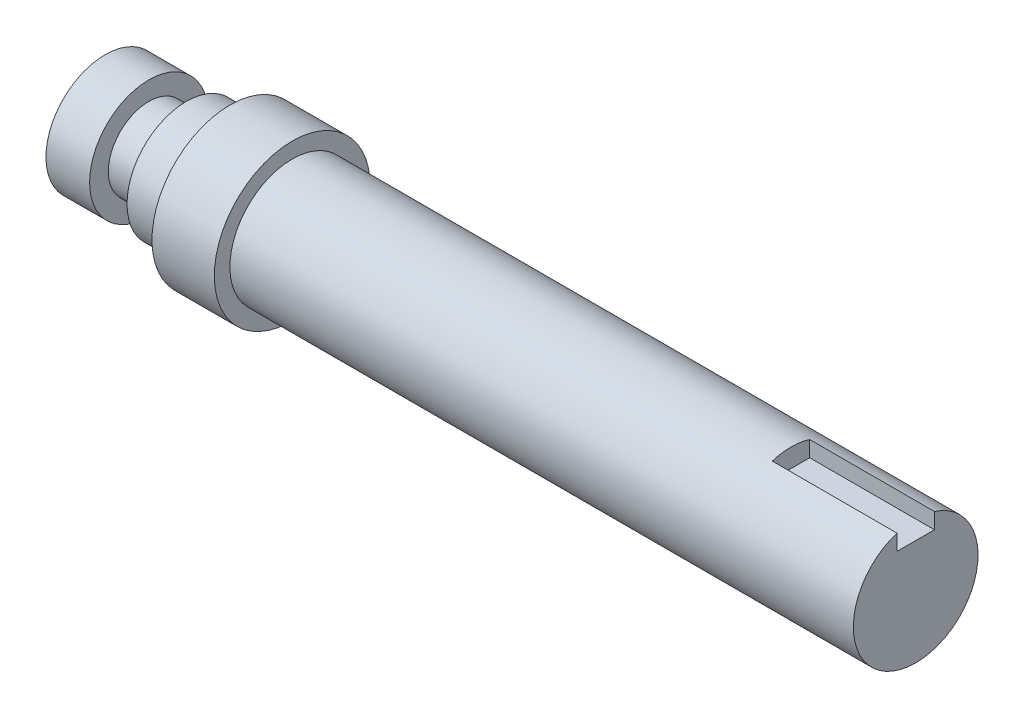
ISO-10303-21;
HEADER;
FILE_DESCRIPTION(('STEP AP214'),'2;1');
FILE_NAME('part.step','',(''),(''),'','','');
FILE_SCHEMA(('AUTOMOTIVE_DESIGN { 1 0 10303 214 1 1 1 1 }'));
ENDSEC;
DATA;
#1=APPLICATION_CONTEXT('core data for automotive mechanical design processes');
#2=APPLICATION_PROTOCOL_DEFINITION('international standard','automotive_design',2000,#1);
#3=PRODUCT_CONTEXT('',#1,'mechanical');
#4=PRODUCT('Part','Part','',(#3));
#5=PRODUCT_RELATED_PRODUCT_CATEGORY('part','',(#4));
#6=PRODUCT_DEFINITION_FORMATION('','',#4);
#7=PRODUCT_DEFINITION_CONTEXT('part definition',#1,'design');
#8=PRODUCT_DEFINITION('design','',#6,#7);
#9=PRODUCT_DEFINITION_SHAPE('','',#8);
#10=(LENGTH_UNIT() NAMED_UNIT(*) SI_UNIT(.MILLI.,.METRE.));
#11=(NAMED_UNIT(*) PLANE_ANGLE_UNIT() SI_UNIT($,.RADIAN.));
#12=(NAMED_UNIT(*) SI_UNIT($,.STERADIAN.) SOLID_ANGLE_UNIT());
#13=UNCERTAINTY_MEASURE_WITH_UNIT(LENGTH_MEASURE(1.E-05),#10,'distance_accuracy_value','');
#14=(GEOMETRIC_REPRESENTATION_CONTEXT(3) GLOBAL_UNCERTAINTY_ASSIGNED_CONTEXT((#13)) GLOBAL_UNIT_ASSIGNED_CONTEXT((#10,
#11,#12)) REPRESENTATION_CONTEXT('',''));
#15=CARTESIAN_POINT('',(0.,0.,0.));
#16=DIRECTION('',(0.,0.,1.));
#17=DIRECTION('',(1.,0.,0.));
#18=AXIS2_PLACEMENT_3D('',#15,#16,#17);
#19=CARTESIAN_POINT('',(0.,0.,0.));
#20=DIRECTION('',(1.,0.,0.));
#21=DIRECTION('',(0.,1.,0.));
#22=AXIS2_PLACEMENT_3D('',#19,#20,#21);
#23=CYLINDRICAL_SURFACE('',#22,9.5);
#24=CARTESIAN_POINT('',(-110.,0.,0.));
#25=DIRECTION('',(1.,0.,0.));
#26=DIRECTION('',(0.,1.,0.));
#27=AXIS2_PLACEMENT_3D('',#24,#25,#26);
#28=CIRCLE('',#27,9.5);
#29=CARTESIAN_POINT('',(-110.,9.49999999999998,0.));
#30=VERTEX_POINT('',#29);
#31=EDGE_CURVE('E147',#30,#30,#28,.T.);
#32=ORIENTED_EDGE('',*,*,#31,.F.);
#33=EDGE_LOOP('',(#32));
#34=FACE_BOUND('',#33,.T.);
#35=CARTESIAN_POINT('',(-117.,0.,0.));
#36=DIRECTION('',(-1.,0.,0.));
#37=DIRECTION('',(0.,-1.,0.));
#38=AXIS2_PLACEMENT_3D('',#35,#36,#37);
#39=CIRCLE('',#38,9.49999999999999);
#40=CARTESIAN_POINT('',(-117.,-9.5,0.));
#41=VERTEX_POINT('',#40);
#42=EDGE_CURVE('E114',#41,#41,#39,.T.);
#43=ORIENTED_EDGE('',*,*,#42,.F.);
#44=EDGE_LOOP('',(#43));
#45=FACE_BOUND('',#44,.T.);
#46=ADVANCED_FACE('F41',(#34,#45),#23,.T.);
#47=CARTESIAN_POINT('',(0.,10.,0.));
#48=DIRECTION('',(1.,0.,0.));
#49=DIRECTION('',(0.,1.,0.));
#50=AXIS2_PLACEMENT_3D('',#47,#48,#49);
#51=PLANE('',#50);
#52=DIRECTION('',(0.,1.,0.));
#53=VECTOR('',#52,1.);
#54=CARTESIAN_POINT('',(0.,12.,-3.));
#55=LINE('',#54,#53);
#56=CARTESIAN_POINT('',(0.,7.,-3.));
#57=VERTEX_POINT('',#56);
#58=CARTESIAN_POINT('',(0.,9.53939201416946,-3.));
#59=VERTEX_POINT('',#58);
#60=EDGE_CURVE('E88',#57,#59,#55,.T.);
#61=ORIENTED_EDGE('',*,*,#60,.F.);
#62=DIRECTION('',(0.,0.,1.));
#63=VECTOR('',#62,1.);
#64=CARTESIAN_POINT('',(0.,7.,-3.));
#65=LINE('',#64,#63);
#66=CARTESIAN_POINT('',(0.,7.,3.));
#67=VERTEX_POINT('',#66);
#68=EDGE_CURVE('E96',#57,#67,#65,.T.);
#69=ORIENTED_EDGE('',*,*,#68,.T.);
#70=DIRECTION('',(0.,1.,0.));
#71=VECTOR('',#70,1.);
#72=CARTESIAN_POINT('',(0.,12.,3.));
#73=LINE('',#72,#71);
#74=CARTESIAN_POINT('',(0.,9.53939201416946,3.));
#75=VERTEX_POINT('',#74);
#76=EDGE_CURVE('E104',#67,#75,#73,.T.);
#77=ORIENTED_EDGE('',*,*,#76,.T.);
#78=CARTESIAN_POINT('',(0.,0.,0.));
#79=DIRECTION('',(1.,0.,0.));
#80=DIRECTION('',(0.,1.,0.));
#81=AXIS2_PLACEMENT_3D('',#78,#79,#80);
#82=CIRCLE('',#81,10.);
#83=EDGE_CURVE('E131',#75,#59,#82,.T.);
#84=ORIENTED_EDGE('',*,*,#83,.T.);
#85=EDGE_LOOP('',(#61,#69,#77,#84));
#86=FACE_BOUND('',#85,.T.);
#87=ADVANCED_FACE('F43',(#86),#51,.T.);
#88=CARTESIAN_POINT('',(-110.,9.49999999999998,0.));
#89=DIRECTION('',(-1.,0.,0.));
#90=DIRECTION('',(0.,-1.,0.));
#91=AXIS2_PLACEMENT_3D('',#88,#89,#90);
#92=PLANE('',#91);
#93=ORIENTED_EDGE('',*,*,#31,.T.);
#94=EDGE_LOOP('',(#93));
#95=FACE_BOUND('',#94,.T.);
#96=CARTESIAN_POINT('',(-110.,0.,0.));
#97=DIRECTION('',(1.,0.,0.));
#98=DIRECTION('',(0.,1.,0.));
#99=AXIS2_PLACEMENT_3D('',#96,#97,#98);
#100=CIRCLE('',#99,12.5);
#101=CARTESIAN_POINT('',(-110.,12.5,0.));
#102=VERTEX_POINT('',#101);
#103=EDGE_CURVE('E143',#102,#102,#100,.T.);
#104=ORIENTED_EDGE('',*,*,#103,.F.);
#105=EDGE_LOOP('',(#104));
#106=FACE_BOUND('',#105,.T.);
#107=ADVANCED_FACE('F167',(#95,#106),#92,.T.);
#108=CARTESIAN_POINT('',(0.,0.,0.));
#109=DIRECTION('',(1.,0.,0.));
#110=DIRECTION('',(0.,1.,0.));
#111=AXIS2_PLACEMENT_3D('',#108,#109,#110);
#112=CYLINDRICAL_SURFACE('',#111,12.5);
#113=ORIENTED_EDGE('',*,*,#103,.T.);
#114=EDGE_LOOP('',(#113));
#115=FACE_BOUND('',#114,.T.);
#116=CARTESIAN_POINT('',(-100.,0.,0.));
#117=DIRECTION('',(1.,0.,0.));
#118=DIRECTION('',(0.,1.,0.));
#119=AXIS2_PLACEMENT_3D('',#116,#117,#118);
#120=CIRCLE('',#119,12.5);
#121=CARTESIAN_POINT('',(-100.,12.5,0.));
#122=VERTEX_POINT('',#121);
#123=EDGE_CURVE('E139',#122,#122,#120,.T.);
#124=ORIENTED_EDGE('',*,*,#123,.F.);
#125=EDGE_LOOP('',(#124));
#126=FACE_BOUND('',#125,.T.);
#127=ADVANCED_FACE('F172',(#115,#126),#112,.T.);
#128=CARTESIAN_POINT('',(-100.,12.5,0.));
#129=DIRECTION('',(1.,0.,0.));
#130=DIRECTION('',(0.,1.,0.));
#131=AXIS2_PLACEMENT_3D('',#128,#129,#130);
#132=PLANE('',#131);
#133=ORIENTED_EDGE('',*,*,#123,.T.);
#134=EDGE_LOOP('',(#133));
#135=FACE_BOUND('',#134,.T.);
#136=CARTESIAN_POINT('',(-100.,0.,0.));
#137=DIRECTION('',(1.,0.,0.));
#138=DIRECTION('',(0.,1.,0.));
#139=AXIS2_PLACEMENT_3D('',#136,#137,#138);
#140=CIRCLE('',#139,10.);
#141=CARTESIAN_POINT('',(-100.,10.,0.));
#142=VERTEX_POINT('',#141);
#143=EDGE_CURVE('E135',#142,#142,#140,.T.);
#144=ORIENTED_EDGE('',*,*,#143,.F.);
#145=EDGE_LOOP('',(#144));
#146=FACE_BOUND('',#145,.T.);
#147=ADVANCED_FACE('F213',(#135,#146),#132,.T.);
#148=CARTESIAN_POINT('',(0.,0.,0.));
#149=DIRECTION('',(1.,0.,0.));
#150=DIRECTION('',(0.,1.,0.));
#151=AXIS2_PLACEMENT_3D('',#148,#149,#150);
#152=CYLINDRICAL_SURFACE('',#151,10.);
#153=DIRECTION('',(1.,0.,0.));
#154=VECTOR('',#153,1.);
#155=CARTESIAN_POINT('',(0.,9.53939201416946,-3.));
#156=LINE('',#155,#154);
#157=CARTESIAN_POINT('',(-20.,9.53939201416946,-3.));
#158=VERTEX_POINT('',#157);
#159=EDGE_CURVE('E11',#59,#158,#156,.F.);
#160=ORIENTED_EDGE('',*,*,#159,.F.);
#161=ORIENTED_EDGE('',*,*,#83,.F.);
#162=DIRECTION('',(1.,0.,0.));
#163=VECTOR('',#162,1.);
#164=CARTESIAN_POINT('',(0.,9.53939201416946,3.));
#165=LINE('',#164,#163);
#166=CARTESIAN_POINT('',(-20.,9.53939201416946,3.));
#167=VERTEX_POINT('',#166);
#168=EDGE_CURVE('E155',#75,#167,#165,.F.);
#169=ORIENTED_EDGE('',*,*,#168,.T.);
#170=CARTESIAN_POINT('',(-20.,0.,0.));
#171=DIRECTION('',(-1.,0.,0.));
#172=DIRECTION('',(0.,0.,1.));
#173=AXIS2_PLACEMENT_3D('',#170,#171,#172);
#174=CIRCLE('',#173,10.);
#175=EDGE_CURVE('E50',#158,#167,#174,.F.);
#176=ORIENTED_EDGE('',*,*,#175,.F.);
#177=EDGE_LOOP('',(#160,#161,#169,#176));
#178=FACE_BOUND('',#177,.T.);
#179=ORIENTED_EDGE('',*,*,#143,.T.);
#180=EDGE_LOOP('',(#179));
#181=FACE_BOUND('',#180,.T.);
#182=ADVANCED_FACE('F161',(#178,#181),#152,.T.);
#183=CARTESIAN_POINT('',(-117.,9.49999999999998,0.));
#184=DIRECTION('',(-1.,0.,0.));
#185=DIRECTION('',(0.,-1.,0.));
#186=AXIS2_PLACEMENT_3D('',#183,#184,#185);
#187=PLANE('',#186);
#188=ORIENTED_EDGE('',*,*,#42,.T.);
#189=EDGE_LOOP('',(#188));
#190=FACE_BOUND('',#189,.T.);
#191=CARTESIAN_POINT('',(-117.,0.,0.));
#192=DIRECTION('',(-1.,0.,0.));
#193=DIRECTION('',(0.,-1.,0.));
#194=AXIS2_PLACEMENT_3D('',#191,#192,#193);
#195=CIRCLE('',#194,6.49999999999999);
#196=CARTESIAN_POINT('',(-117.,-6.5,0.));
#197=VERTEX_POINT('',#196);
#198=EDGE_CURVE('E127',#197,#197,#195,.T.);
#199=ORIENTED_EDGE('',*,*,#198,.F.);
#200=EDGE_LOOP('',(#199));
#201=FACE_BOUND('',#200,.T.);
#202=ADVANCED_FACE('F203',(#190,#201),#187,.T.);
#203=CARTESIAN_POINT('',(-130.,0.,0.));
#204=DIRECTION('',(-1.,0.,0.));
#205=DIRECTION('',(0.,-1.,0.));
#206=AXIS2_PLACEMENT_3D('',#203,#204,#205);
#207=CYLINDRICAL_SURFACE('',#206,6.49999999999999);
#208=ORIENTED_EDGE('',*,*,#198,.T.);
#209=EDGE_LOOP('',(#208));
#210=FACE_BOUND('',#209,.T.);
#211=CARTESIAN_POINT('',(-123.,0.,0.));
#212=DIRECTION('',(-1.,0.,0.));
#213=DIRECTION('',(0.,-1.,0.));
#214=AXIS2_PLACEMENT_3D('',#211,#212,#213);
#215=CIRCLE('',#214,6.5);
#216=CARTESIAN_POINT('',(-123.,-6.50000000000001,0.));
#217=VERTEX_POINT('',#216);
#218=EDGE_CURVE('E123',#217,#217,#215,.T.);
#219=ORIENTED_EDGE('',*,*,#218,.F.);
#220=EDGE_LOOP('',(#219));
#221=FACE_BOUND('',#220,.T.);
#222=ADVANCED_FACE('F197',(#210,#221),#207,.T.);
#223=CARTESIAN_POINT('',(-123.,9.49999999999998,0.));
#224=DIRECTION('',(1.,0.,0.));
#225=DIRECTION('',(0.,1.,0.));
#226=AXIS2_PLACEMENT_3D('',#223,#224,#225);
#227=PLANE('',#226);
#228=ORIENTED_EDGE('',*,*,#218,.T.);
#229=EDGE_LOOP('',(#228));
#230=FACE_BOUND('',#229,.T.);
#231=CARTESIAN_POINT('',(-123.,0.,0.));
#232=DIRECTION('',(-1.,0.,0.));
#233=DIRECTION('',(0.,-1.,0.));
#234=AXIS2_PLACEMENT_3D('',#231,#232,#233);
#235=CIRCLE('',#234,9.5);
#236=CARTESIAN_POINT('',(-123.,-9.50000000000001,0.));
#237=VERTEX_POINT('',#236);
#238=EDGE_CURVE('E119',#237,#237,#235,.T.);
#239=ORIENTED_EDGE('',*,*,#238,.F.);
#240=EDGE_LOOP('',(#239));
#241=FACE_BOUND('',#240,.T.);
#242=ADVANCED_FACE('F190',(#230,#241),#227,.T.);
#243=CARTESIAN_POINT('',(-130.,0.,0.));
#244=DIRECTION('',(-1.,0.,0.));
#245=DIRECTION('',(0.,-1.,0.));
#246=AXIS2_PLACEMENT_3D('',#243,#244,#245);
#247=PLANE('',#246);
#248=CARTESIAN_POINT('',(-130.,0.,0.));
#249=DIRECTION('',(1.,0.,0.));
#250=DIRECTION('',(0.,1.,0.));
#251=AXIS2_PLACEMENT_3D('',#248,#249,#250);
#252=CIRCLE('',#251,9.5);
#253=CARTESIAN_POINT('',(-130.,9.49999999999998,0.));
#254=VERTEX_POINT('',#253);
#255=EDGE_CURVE('E151',#254,#254,#252,.T.);
#256=ORIENTED_EDGE('',*,*,#255,.F.);
#257=EDGE_LOOP('',(#256));
#258=FACE_BOUND('',#257,.T.);
#259=ADVANCED_FACE('F183',(#258),#247,.T.);
#260=ORIENTED_EDGE('',*,*,#255,.T.);
#261=EDGE_LOOP('',(#260));
#262=FACE_BOUND('',#261,.T.);
#263=ORIENTED_EDGE('',*,*,#238,.T.);
#264=EDGE_LOOP('',(#263));
#265=FACE_BOUND('',#264,.T.);
#266=ADVANCED_FACE('F177',(#262,#265),#23,.T.);
#267=CARTESIAN_POINT('',(0.,7.,-3.));
#268=DIRECTION('',(0.,-1.,0.));
#269=DIRECTION('',(1.,0.,0.));
#270=AXIS2_PLACEMENT_3D('',#267,#268,#269);
#271=PLANE('',#270);
#272=DIRECTION('',(1.,0.,0.));
#273=VECTOR('',#272,1.);
#274=CARTESIAN_POINT('',(0.,7.,3.));
#275=LINE('',#274,#273);
#276=CARTESIAN_POINT('',(-20.,7.,3.));
#277=VERTEX_POINT('',#276);
#278=EDGE_CURVE('E110',#277,#67,#275,.T.);
#279=ORIENTED_EDGE('',*,*,#278,.T.);
#280=ORIENTED_EDGE('',*,*,#68,.F.);
#281=DIRECTION('',(1.,0.,0.));
#282=VECTOR('',#281,1.);
#283=CARTESIAN_POINT('',(0.,7.,-3.));
#284=LINE('',#283,#282);
#285=CARTESIAN_POINT('',(-20.,7.,-3.));
#286=VERTEX_POINT('',#285);
#287=EDGE_CURVE('E83',#286,#57,#284,.T.);
#288=ORIENTED_EDGE('',*,*,#287,.F.);
#289=DIRECTION('',(0.,0.,1.));
#290=VECTOR('',#289,1.);
#291=CARTESIAN_POINT('',(-20.,7.,-3.));
#292=LINE('',#291,#290);
#293=EDGE_CURVE('E91',#286,#277,#292,.T.);
#294=ORIENTED_EDGE('',*,*,#293,.T.);
#295=EDGE_LOOP('',(#279,#280,#288,#294));
#296=FACE_BOUND('',#295,.T.);
#297=ADVANCED_FACE('F98',(#296),#271,.F.);
#298=CARTESIAN_POINT('',(-20.,12.,-3.));
#299=DIRECTION('',(-1.,0.,0.));
#300=DIRECTION('',(0.,0.,1.));
#301=AXIS2_PLACEMENT_3D('',#298,#299,#300);
#302=PLANE('',#301);
#303=ORIENTED_EDGE('',*,*,#175,.T.);
#304=DIRECTION('',(0.,-1.,0.));
#305=VECTOR('',#304,1.);
#306=CARTESIAN_POINT('',(-20.,12.,3.));
#307=LINE('',#306,#305);
#308=EDGE_CURVE('E57',#167,#277,#307,.T.);
#309=ORIENTED_EDGE('',*,*,#308,.T.);
#310=ORIENTED_EDGE('',*,*,#293,.F.);
#311=DIRECTION('',(0.,-1.,0.));
#312=VECTOR('',#311,1.);
#313=CARTESIAN_POINT('',(-20.,12.,-3.));
#314=LINE('',#313,#312);
#315=EDGE_CURVE('E79',#158,#286,#314,.T.);
#316=ORIENTED_EDGE('',*,*,#315,.F.);
#317=EDGE_LOOP('',(#303,#309,#310,#316));
#318=FACE_BOUND('',#317,.T.);
#319=ADVANCED_FACE('F92',(#318),#302,.F.);
#320=CARTESIAN_POINT('',(0.,0.,-3.));
#321=DIRECTION('',(0.,0.,-1.));
#322=DIRECTION('',(-1.,0.,0.));
#323=AXIS2_PLACEMENT_3D('',#320,#321,#322);
#324=PLANE('',#323);
#325=ORIENTED_EDGE('',*,*,#159,.T.);
#326=ORIENTED_EDGE('',*,*,#315,.T.);
#327=ORIENTED_EDGE('',*,*,#287,.T.);
#328=ORIENTED_EDGE('',*,*,#60,.T.);
#329=EDGE_LOOP('',(#325,#326,#327,#328));
#330=FACE_BOUND('',#329,.T.);
#331=ADVANCED_FACE('F81',(#330),#324,.F.);
#332=CARTESIAN_POINT('',(0.,0.,3.));
#333=DIRECTION('',(0.,0.,-1.));
#334=DIRECTION('',(-1.,0.,0.));
#335=AXIS2_PLACEMENT_3D('',#332,#333,#334);
#336=PLANE('',#335);
#337=ORIENTED_EDGE('',*,*,#76,.F.);
#338=ORIENTED_EDGE('',*,*,#278,.F.);
#339=ORIENTED_EDGE('',*,*,#308,.F.);
#340=ORIENTED_EDGE('',*,*,#168,.F.);
#341=EDGE_LOOP('',(#337,#338,#339,#340));
#342=FACE_BOUND('',#341,.T.);
#343=ADVANCED_FACE('F163',(#342),#336,.T.);
#344=CLOSED_SHELL('',(#46,#87,#107,#127,#147,#182,#202,#222,#242,#259,#266,#297,#319,#331,#343));
#345=MANIFOLD_SOLID_BREP('B2',#344);
#346=ADVANCED_BREP_SHAPE_REPRESENTATION('',(#18,#345),#14);
#347=SHAPE_DEFINITION_REPRESENTATION(#9,#346);
ENDSEC;
END-ISO-10303-21;
